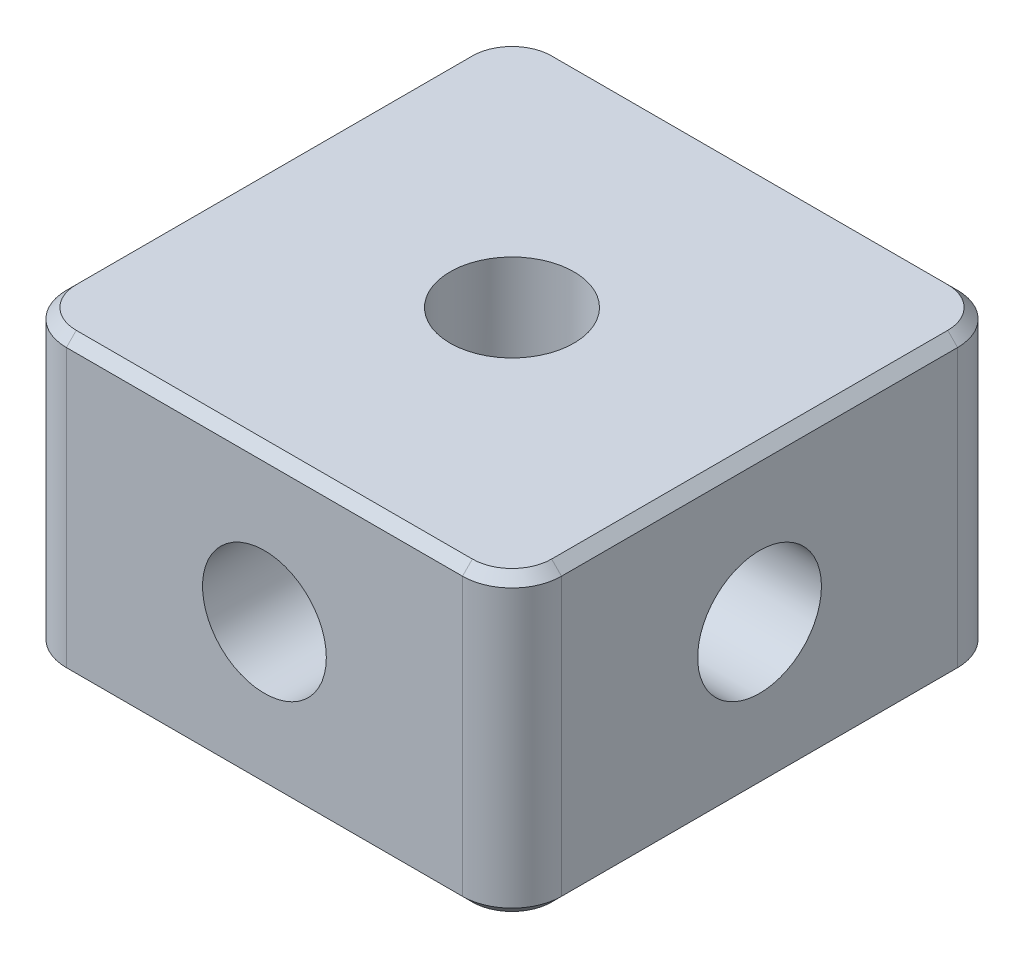
ISO-10303-21;
HEADER;
FILE_DESCRIPTION(('STEP AP214'),'2;1');
FILE_NAME('part.step','',(''),(''),'','','');
FILE_SCHEMA(('AUTOMOTIVE_DESIGN { 1 0 10303 214 1 1 1 1 }'));
ENDSEC;
DATA;
#1=APPLICATION_CONTEXT('core data for automotive mechanical design processes');
#2=APPLICATION_PROTOCOL_DEFINITION('international standard','automotive_design',2000,#1);
#3=PRODUCT_CONTEXT('',#1,'mechanical');
#4=PRODUCT('Part','Part','',(#3));
#5=PRODUCT_RELATED_PRODUCT_CATEGORY('part','',(#4));
#6=PRODUCT_DEFINITION_FORMATION('','',#4);
#7=PRODUCT_DEFINITION_CONTEXT('part definition',#1,'design');
#8=PRODUCT_DEFINITION('design','',#6,#7);
#9=PRODUCT_DEFINITION_SHAPE('','',#8);
#10=(LENGTH_UNIT() NAMED_UNIT(*) SI_UNIT(.MILLI.,.METRE.));
#11=(NAMED_UNIT(*) PLANE_ANGLE_UNIT() SI_UNIT($,.RADIAN.));
#12=(NAMED_UNIT(*) SI_UNIT($,.STERADIAN.) SOLID_ANGLE_UNIT());
#13=UNCERTAINTY_MEASURE_WITH_UNIT(LENGTH_MEASURE(1.E-05),#10,'distance_accuracy_value','');
#14=(GEOMETRIC_REPRESENTATION_CONTEXT(3) GLOBAL_UNCERTAINTY_ASSIGNED_CONTEXT((#13)) GLOBAL_UNIT_ASSIGNED_CONTEXT((#10,
#11,#12)) REPRESENTATION_CONTEXT('',''));
#15=CARTESIAN_POINT('',(0.,0.,0.));
#16=DIRECTION('',(0.,0.,1.));
#17=DIRECTION('',(1.,0.,0.));
#18=AXIS2_PLACEMENT_3D('',#15,#16,#17);
#19=CARTESIAN_POINT('',(0.,3.,0.));
#20=DIRECTION('',(0.,1.,0.));
#21=DIRECTION('',(0.,0.,1.));
#22=AXIS2_PLACEMENT_3D('',#19,#20,#21);
#23=CYLINDRICAL_SURFACE('',#22,1.25);
#24=CARTESIAN_POINT('',(0.,3.,0.));
#25=DIRECTION('',(0.,1.,0.));
#26=DIRECTION('',(0.,0.,1.));
#27=AXIS2_PLACEMENT_3D('',#24,#25,#26);
#28=CIRCLE('',#27,1.25);
#29=CARTESIAN_POINT('',(0.,3.,1.25));
#30=VERTEX_POINT('',#29);
#31=EDGE_CURVE('E483',#30,#30,#28,.T.);
#32=ORIENTED_EDGE('',*,*,#31,.T.);
#33=EDGE_LOOP('',(#32));
#34=FACE_BOUND('',#33,.T.);
#35=CARTESIAN_POINT('',(0.,0.,0.));
#36=DIRECTION('',(0.,0.707106781186547,-0.707106781186547));
#37=DIRECTION('',(0.,0.707106781186547,0.707106781186547));
#38=AXIS2_PLACEMENT_3D('',#35,#36,#37);
#39=ELLIPSE('',#38,1.76776695296636,1.24999999999999);
#40=CARTESIAN_POINT('',(0.883883476483181,0.883883476483181,0.883883476483181));
#41=VERTEX_POINT('',#40);
#42=CARTESIAN_POINT('',(-0.88388347648318,0.88388347648318,0.88388347648318));
#43=VERTEX_POINT('',#42);
#44=EDGE_CURVE('E492',#41,#43,#39,.F.);
#45=ORIENTED_EDGE('',*,*,#44,.T.);
#46=CARTESIAN_POINT('',(0.,0.,0.));
#47=DIRECTION('',(0.707106781186547,0.707106781186547,0.));
#48=DIRECTION('',(-0.707106781186547,0.707106781186547,0.));
#49=AXIS2_PLACEMENT_3D('',#46,#47,#48);
#50=ELLIPSE('',#49,1.76776695296636,1.24999999999999);
#51=CARTESIAN_POINT('',(-0.88388347648318,0.88388347648318,-0.88388347648318));
#52=VERTEX_POINT('',#51);
#53=EDGE_CURVE('E194',#43,#52,#50,.F.);
#54=ORIENTED_EDGE('',*,*,#53,.T.);
#55=CARTESIAN_POINT('',(0.,0.,0.));
#56=DIRECTION('',(0.,0.707106781186547,0.707106781186547));
#57=DIRECTION('',(0.,0.707106781186547,-0.707106781186547));
#58=AXIS2_PLACEMENT_3D('',#55,#56,#57);
#59=ELLIPSE('',#58,1.76776695296636,1.24999999999999);
#60=CARTESIAN_POINT('',(0.883883476483181,0.883883476483181,-0.883883476483181));
#61=VERTEX_POINT('',#60);
#62=EDGE_CURVE('E195',#52,#61,#59,.F.);
#63=ORIENTED_EDGE('',*,*,#62,.T.);
#64=CARTESIAN_POINT('',(0.,0.,0.));
#65=DIRECTION('',(-0.707106781186547,0.707106781186547,0.));
#66=DIRECTION('',(0.707106781186547,0.707106781186547,0.));
#67=AXIS2_PLACEMENT_3D('',#64,#65,#66);
#68=ELLIPSE('',#67,1.76776695296636,1.24999999999999);
#69=EDGE_CURVE('E182',#61,#41,#68,.F.);
#70=ORIENTED_EDGE('',*,*,#69,.T.);
#71=EDGE_LOOP('',(#45,#54,#63,#70));
#72=FACE_BOUND('',#71,.T.);
#73=ADVANCED_FACE('F41',(#34,#72),#23,.F.);
#74=CARTESIAN_POINT('',(5.,3.,5.));
#75=DIRECTION('',(-1.,0.,0.));
#76=DIRECTION('',(0.,0.,1.));
#77=AXIS2_PLACEMENT_3D('',#74,#75,#76);
#78=PLANE('',#77);
#79=CARTESIAN_POINT('',(5.,0.,0.));
#80=DIRECTION('',(1.,0.,0.));
#81=DIRECTION('',(0.,0.,-1.));
#82=AXIS2_PLACEMENT_3D('',#79,#80,#81);
#83=CIRCLE('',#82,1.24999999999999);
#84=CARTESIAN_POINT('',(5.,0.,-1.24999999999999));
#85=VERTEX_POINT('',#84);
#86=EDGE_CURVE('E374',#85,#85,#83,.T.);
#87=ORIENTED_EDGE('',*,*,#86,.F.);
#88=EDGE_LOOP('',(#87));
#89=FACE_BOUND('',#88,.T.);
#90=DIRECTION('',(0.,-1.,0.));
#91=VECTOR('',#90,1.);
#92=CARTESIAN_POINT('',(5.,3.,4.));
#93=LINE('',#92,#91);
#94=CARTESIAN_POINT('',(5.,2.8,4.));
#95=VERTEX_POINT('',#94);
#96=CARTESIAN_POINT('',(5.,-2.8,4.));
#97=VERTEX_POINT('',#96);
#98=EDGE_CURVE('E226',#95,#97,#93,.T.);
#99=ORIENTED_EDGE('',*,*,#98,.T.);
#100=DIRECTION('',(0.,0.,-1.));
#101=VECTOR('',#100,1.);
#102=CARTESIAN_POINT('',(5.,-2.8,-4.));
#103=LINE('',#102,#101);
#104=CARTESIAN_POINT('',(5.,-2.8,-4.));
#105=VERTEX_POINT('',#104);
#106=EDGE_CURVE('E254',#97,#105,#103,.T.);
#107=ORIENTED_EDGE('',*,*,#106,.T.);
#108=DIRECTION('',(0.,-1.,0.));
#109=VECTOR('',#108,1.);
#110=CARTESIAN_POINT('',(5.,3.,-4.));
#111=LINE('',#110,#109);
#112=CARTESIAN_POINT('',(5.,2.8,-4.));
#113=VERTEX_POINT('',#112);
#114=EDGE_CURVE('E230',#105,#113,#111,.F.);
#115=ORIENTED_EDGE('',*,*,#114,.T.);
#116=DIRECTION('',(0.,0.,1.));
#117=VECTOR('',#116,1.);
#118=CARTESIAN_POINT('',(5.,2.8,5.));
#119=LINE('',#118,#117);
#120=EDGE_CURVE('E250',#113,#95,#119,.T.);
#121=ORIENTED_EDGE('',*,*,#120,.T.);
#122=EDGE_LOOP('',(#99,#107,#115,#121));
#123=FACE_BOUND('',#122,.T.);
#124=ADVANCED_FACE('F468',(#89,#123),#78,.F.);
#125=CARTESIAN_POINT('',(-5.,3.,-5.));
#126=DIRECTION('',(0.,0.,1.));
#127=DIRECTION('',(1.,0.,0.));
#128=AXIS2_PLACEMENT_3D('',#125,#126,#127);
#129=PLANE('',#128);
#130=CARTESIAN_POINT('',(0.,0.,-5.));
#131=DIRECTION('',(0.,0.,1.));
#132=DIRECTION('',(1.,0.,0.));
#133=AXIS2_PLACEMENT_3D('',#130,#131,#132);
#134=CIRCLE('',#133,1.25);
#135=CARTESIAN_POINT('',(1.25,0.,-5.));
#136=VERTEX_POINT('',#135);
#137=EDGE_CURVE('E487',#136,#136,#134,.T.);
#138=ORIENTED_EDGE('',*,*,#137,.T.);
#139=EDGE_LOOP('',(#138));
#140=FACE_BOUND('',#139,.T.);
#141=DIRECTION('',(0.,-1.,0.));
#142=VECTOR('',#141,1.);
#143=CARTESIAN_POINT('',(4.,3.,-5.));
#144=LINE('',#143,#142);
#145=CARTESIAN_POINT('',(4.,2.8,-5.));
#146=VERTEX_POINT('',#145);
#147=CARTESIAN_POINT('',(4.,-2.8,-5.));
#148=VERTEX_POINT('',#147);
#149=EDGE_CURVE('E222',#146,#148,#144,.T.);
#150=ORIENTED_EDGE('',*,*,#149,.T.);
#151=DIRECTION('',(-1.,0.,0.));
#152=VECTOR('',#151,1.);
#153=CARTESIAN_POINT('',(-4.,-2.8,-5.));
#154=LINE('',#153,#152);
#155=CARTESIAN_POINT('',(-4.,-2.8,-5.));
#156=VERTEX_POINT('',#155);
#157=EDGE_CURVE('E298',#148,#156,#154,.T.);
#158=ORIENTED_EDGE('',*,*,#157,.T.);
#159=DIRECTION('',(0.,-1.,0.));
#160=VECTOR('',#159,1.);
#161=CARTESIAN_POINT('',(-4.,3.,-5.));
#162=LINE('',#161,#160);
#163=CARTESIAN_POINT('',(-4.,2.8,-5.));
#164=VERTEX_POINT('',#163);
#165=EDGE_CURVE('E218',#156,#164,#162,.F.);
#166=ORIENTED_EDGE('',*,*,#165,.T.);
#167=DIRECTION('',(1.,0.,0.));
#168=VECTOR('',#167,1.);
#169=CARTESIAN_POINT('',(-5.,2.8,-5.));
#170=LINE('',#169,#168);
#171=EDGE_CURVE('E295',#164,#146,#170,.T.);
#172=ORIENTED_EDGE('',*,*,#171,.T.);
#173=EDGE_LOOP('',(#150,#158,#166,#172));
#174=FACE_BOUND('',#173,.T.);
#175=ADVANCED_FACE('F531',(#140,#174),#129,.F.);
#176=CARTESIAN_POINT('',(-5.,3.,5.));
#177=DIRECTION('',(1.,0.,0.));
#178=DIRECTION('',(0.,0.,-1.));
#179=AXIS2_PLACEMENT_3D('',#176,#177,#178);
#180=PLANE('',#179);
#181=CARTESIAN_POINT('',(-5.,0.,0.));
#182=DIRECTION('',(1.,0.,0.));
#183=DIRECTION('',(0.,0.,-1.));
#184=AXIS2_PLACEMENT_3D('',#181,#182,#183);
#185=CIRCLE('',#184,1.25);
#186=CARTESIAN_POINT('',(-5.,0.,-1.25));
#187=VERTEX_POINT('',#186);
#188=EDGE_CURVE('E820',#187,#187,#185,.T.);
#189=ORIENTED_EDGE('',*,*,#188,.T.);
#190=EDGE_LOOP('',(#189));
#191=FACE_BOUND('',#190,.T.);
#192=DIRECTION('',(0.,-1.,0.));
#193=VECTOR('',#192,1.);
#194=CARTESIAN_POINT('',(-5.,3.,-4.));
#195=LINE('',#194,#193);
#196=CARTESIAN_POINT('',(-5.,2.8,-4.));
#197=VERTEX_POINT('',#196);
#198=CARTESIAN_POINT('',(-5.,-2.8,-4.));
#199=VERTEX_POINT('',#198);
#200=EDGE_CURVE('E242',#197,#199,#195,.T.);
#201=ORIENTED_EDGE('',*,*,#200,.T.);
#202=DIRECTION('',(0.,0.,1.));
#203=VECTOR('',#202,1.);
#204=CARTESIAN_POINT('',(-5.,-2.8,4.));
#205=LINE('',#204,#203);
#206=CARTESIAN_POINT('',(-5.,-2.8,4.));
#207=VERTEX_POINT('',#206);
#208=EDGE_CURVE('E322',#199,#207,#205,.T.);
#209=ORIENTED_EDGE('',*,*,#208,.T.);
#210=DIRECTION('',(0.,-1.,0.));
#211=VECTOR('',#210,1.);
#212=CARTESIAN_POINT('',(-5.,3.,4.));
#213=LINE('',#212,#211);
#214=CARTESIAN_POINT('',(-5.,2.8,4.));
#215=VERTEX_POINT('',#214);
#216=EDGE_CURVE('E246',#207,#215,#213,.F.);
#217=ORIENTED_EDGE('',*,*,#216,.T.);
#218=DIRECTION('',(0.,0.,-1.));
#219=VECTOR('',#218,1.);
#220=CARTESIAN_POINT('',(-5.,2.8,5.));
#221=LINE('',#220,#219);
#222=EDGE_CURVE('E319',#215,#197,#221,.T.);
#223=ORIENTED_EDGE('',*,*,#222,.T.);
#224=EDGE_LOOP('',(#201,#209,#217,#223));
#225=FACE_BOUND('',#224,.T.);
#226=ADVANCED_FACE('F415',(#191,#225),#180,.F.);
#227=CARTESIAN_POINT('',(-5.,3.,5.));
#228=DIRECTION('',(0.,0.,-1.));
#229=DIRECTION('',(-1.,0.,0.));
#230=AXIS2_PLACEMENT_3D('',#227,#228,#229);
#231=PLANE('',#230);
#232=CARTESIAN_POINT('',(0.,0.,5.));
#233=DIRECTION('',(0.,0.,1.));
#234=DIRECTION('',(1.,0.,0.));
#235=AXIS2_PLACEMENT_3D('',#232,#233,#234);
#236=CIRCLE('',#235,1.24999999999999);
#237=CARTESIAN_POINT('',(1.24999999999999,0.,5.));
#238=VERTEX_POINT('',#237);
#239=EDGE_CURVE('E495',#238,#238,#236,.T.);
#240=ORIENTED_EDGE('',*,*,#239,.F.);
#241=EDGE_LOOP('',(#240));
#242=FACE_BOUND('',#241,.T.);
#243=DIRECTION('',(0.,-1.,0.));
#244=VECTOR('',#243,1.);
#245=CARTESIAN_POINT('',(-4.,3.,5.));
#246=LINE('',#245,#244);
#247=CARTESIAN_POINT('',(-4.,2.8,5.));
#248=VERTEX_POINT('',#247);
#249=CARTESIAN_POINT('',(-4.,-2.8,5.));
#250=VERTEX_POINT('',#249);
#251=EDGE_CURVE('E234',#248,#250,#246,.T.);
#252=ORIENTED_EDGE('',*,*,#251,.T.);
#253=DIRECTION('',(1.,0.,0.));
#254=VECTOR('',#253,1.);
#255=CARTESIAN_POINT('',(4.,-2.8,5.));
#256=LINE('',#255,#254);
#257=CARTESIAN_POINT('',(4.,-2.8,5.));
#258=VERTEX_POINT('',#257);
#259=EDGE_CURVE('E304',#250,#258,#256,.T.);
#260=ORIENTED_EDGE('',*,*,#259,.T.);
#261=DIRECTION('',(0.,-1.,0.));
#262=VECTOR('',#261,1.);
#263=CARTESIAN_POINT('',(4.,3.,5.));
#264=LINE('',#263,#262);
#265=CARTESIAN_POINT('',(4.,2.8,5.));
#266=VERTEX_POINT('',#265);
#267=EDGE_CURVE('E238',#258,#266,#264,.F.);
#268=ORIENTED_EDGE('',*,*,#267,.T.);
#269=DIRECTION('',(-1.,0.,0.));
#270=VECTOR('',#269,1.);
#271=CARTESIAN_POINT('',(-5.,2.8,5.));
#272=LINE('',#271,#270);
#273=EDGE_CURVE('E301',#266,#248,#272,.T.);
#274=ORIENTED_EDGE('',*,*,#273,.T.);
#275=EDGE_LOOP('',(#252,#260,#268,#274));
#276=FACE_BOUND('',#275,.T.);
#277=ADVANCED_FACE('F448',(#242,#276),#231,.F.);
#278=CARTESIAN_POINT('',(0.,3.,0.));
#279=DIRECTION('',(0.,-1.,0.));
#280=DIRECTION('',(0.,0.,-1.));
#281=AXIS2_PLACEMENT_3D('',#278,#279,#280);
#282=PLANE('',#281);
#283=CARTESIAN_POINT('',(4.,3.,4.));
#284=DIRECTION('',(0.,-1.,0.));
#285=DIRECTION('',(0.,0.,-1.));
#286=AXIS2_PLACEMENT_3D('',#283,#284,#285);
#287=CIRCLE('',#286,0.800000000000001);
#288=CARTESIAN_POINT('',(4.,3.,4.8));
#289=VERTEX_POINT('',#288);
#290=CARTESIAN_POINT('',(4.8,3.,4.));
#291=VERTEX_POINT('',#290);
#292=EDGE_CURVE('E66',#289,#291,#287,.F.);
#293=ORIENTED_EDGE('',*,*,#292,.T.);
#294=DIRECTION('',(0.,0.,-1.));
#295=VECTOR('',#294,1.);
#296=CARTESIAN_POINT('',(4.8,3.,0.));
#297=LINE('',#296,#295);
#298=CARTESIAN_POINT('',(4.8,3.,-4.));
#299=VERTEX_POINT('',#298);
#300=EDGE_CURVE('E11',#291,#299,#297,.T.);
#301=ORIENTED_EDGE('',*,*,#300,.T.);
#302=CARTESIAN_POINT('',(4.,3.,-4.));
#303=DIRECTION('',(0.,-1.,0.));
#304=DIRECTION('',(0.,0.,-1.));
#305=AXIS2_PLACEMENT_3D('',#302,#303,#304);
#306=CIRCLE('',#305,0.800000000000001);
#307=CARTESIAN_POINT('',(4.,3.,-4.8));
#308=VERTEX_POINT('',#307);
#309=EDGE_CURVE('E51',#299,#308,#306,.F.);
#310=ORIENTED_EDGE('',*,*,#309,.T.);
#311=DIRECTION('',(-1.,0.,0.));
#312=VECTOR('',#311,1.);
#313=CARTESIAN_POINT('',(0.,3.,-4.8));
#314=LINE('',#313,#312);
#315=CARTESIAN_POINT('',(-4.,3.,-4.8));
#316=VERTEX_POINT('',#315);
#317=EDGE_CURVE('E337',#308,#316,#314,.T.);
#318=ORIENTED_EDGE('',*,*,#317,.T.);
#319=CARTESIAN_POINT('',(-4.,3.,-4.));
#320=DIRECTION('',(0.,-1.,0.));
#321=DIRECTION('',(0.,0.,-1.));
#322=AXIS2_PLACEMENT_3D('',#319,#320,#321);
#323=CIRCLE('',#322,0.800000000000001);
#324=CARTESIAN_POINT('',(-4.8,3.,-4.));
#325=VERTEX_POINT('',#324);
#326=EDGE_CURVE('E331',#316,#325,#323,.F.);
#327=ORIENTED_EDGE('',*,*,#326,.T.);
#328=DIRECTION('',(0.,0.,1.));
#329=VECTOR('',#328,1.);
#330=CARTESIAN_POINT('',(-4.8,3.,0.));
#331=LINE('',#330,#329);
#332=CARTESIAN_POINT('',(-4.8,3.,4.));
#333=VERTEX_POINT('',#332);
#334=EDGE_CURVE('E325',#325,#333,#331,.T.);
#335=ORIENTED_EDGE('',*,*,#334,.T.);
#336=CARTESIAN_POINT('',(-4.,3.,4.));
#337=DIRECTION('',(0.,-1.,0.));
#338=DIRECTION('',(0.,0.,-1.));
#339=AXIS2_PLACEMENT_3D('',#336,#337,#338);
#340=CIRCLE('',#339,0.800000000000001);
#341=CARTESIAN_POINT('',(-4.,3.,4.8));
#342=VERTEX_POINT('',#341);
#343=EDGE_CURVE('E328',#333,#342,#340,.F.);
#344=ORIENTED_EDGE('',*,*,#343,.T.);
#345=DIRECTION('',(1.,0.,0.));
#346=VECTOR('',#345,1.);
#347=CARTESIAN_POINT('',(0.,3.,4.8));
#348=LINE('',#347,#346);
#349=EDGE_CURVE('E334',#342,#289,#348,.T.);
#350=ORIENTED_EDGE('',*,*,#349,.T.);
#351=EDGE_LOOP('',(#293,#301,#310,#318,#327,#335,#344,#350));
#352=FACE_BOUND('',#351,.T.);
#353=ORIENTED_EDGE('',*,*,#31,.F.);
#354=EDGE_LOOP('',(#353));
#355=FACE_BOUND('',#354,.T.);
#356=ADVANCED_FACE('F477',(#352,#355),#282,.F.);
#357=CARTESIAN_POINT('',(0.,-3.,0.));
#358=DIRECTION('',(0.,-1.,0.));
#359=DIRECTION('',(0.,0.,-1.));
#360=AXIS2_PLACEMENT_3D('',#357,#358,#359);
#361=PLANE('',#360);
#362=CARTESIAN_POINT('',(4.,-3.,-4.));
#363=DIRECTION('',(0.,-1.,0.));
#364=DIRECTION('',(0.,0.,-1.));
#365=AXIS2_PLACEMENT_3D('',#362,#363,#364);
#366=CIRCLE('',#365,0.800000000000003);
#367=CARTESIAN_POINT('',(4.,-3.,-4.8));
#368=VERTEX_POINT('',#367);
#369=CARTESIAN_POINT('',(4.8,-3.,-4.));
#370=VERTEX_POINT('',#369);
#371=EDGE_CURVE('E276',#368,#370,#366,.T.);
#372=ORIENTED_EDGE('',*,*,#371,.T.);
#373=DIRECTION('',(0.,0.,1.));
#374=VECTOR('',#373,1.);
#375=CARTESIAN_POINT('',(4.8,-3.,4.));
#376=LINE('',#375,#374);
#377=CARTESIAN_POINT('',(4.8,-3.,4.));
#378=VERTEX_POINT('',#377);
#379=EDGE_CURVE('E279',#370,#378,#376,.T.);
#380=ORIENTED_EDGE('',*,*,#379,.T.);
#381=CARTESIAN_POINT('',(4.,-3.,4.));
#382=DIRECTION('',(0.,-1.,0.));
#383=DIRECTION('',(0.,0.,-1.));
#384=AXIS2_PLACEMENT_3D('',#381,#382,#383);
#385=CIRCLE('',#384,0.800000000000003);
#386=CARTESIAN_POINT('',(4.,-3.,4.8));
#387=VERTEX_POINT('',#386);
#388=EDGE_CURVE('E273',#378,#387,#385,.T.);
#389=ORIENTED_EDGE('',*,*,#388,.T.);
#390=DIRECTION('',(-1.,0.,0.));
#391=VECTOR('',#390,1.);
#392=CARTESIAN_POINT('',(-4.,-3.,4.8));
#393=LINE('',#392,#391);
#394=CARTESIAN_POINT('',(-4.,-3.,4.8));
#395=VERTEX_POINT('',#394);
#396=EDGE_CURVE('E267',#387,#395,#393,.T.);
#397=ORIENTED_EDGE('',*,*,#396,.T.);
#398=CARTESIAN_POINT('',(-4.,-3.,4.));
#399=DIRECTION('',(0.,-1.,0.));
#400=DIRECTION('',(0.,0.,-1.));
#401=AXIS2_PLACEMENT_3D('',#398,#399,#400);
#402=CIRCLE('',#401,0.800000000000003);
#403=CARTESIAN_POINT('',(-4.8,-3.,4.));
#404=VERTEX_POINT('',#403);
#405=EDGE_CURVE('E261',#395,#404,#402,.T.);
#406=ORIENTED_EDGE('',*,*,#405,.T.);
#407=DIRECTION('',(0.,0.,-1.));
#408=VECTOR('',#407,1.);
#409=CARTESIAN_POINT('',(-4.8,-3.,-4.));
#410=LINE('',#409,#408);
#411=CARTESIAN_POINT('',(-4.8,-3.,-4.));
#412=VERTEX_POINT('',#411);
#413=EDGE_CURVE('E258',#404,#412,#410,.T.);
#414=ORIENTED_EDGE('',*,*,#413,.T.);
#415=CARTESIAN_POINT('',(-4.,-3.,-4.));
#416=DIRECTION('',(0.,-1.,0.));
#417=DIRECTION('',(0.,0.,-1.));
#418=AXIS2_PLACEMENT_3D('',#415,#416,#417);
#419=CIRCLE('',#418,0.800000000000003);
#420=CARTESIAN_POINT('',(-4.,-3.,-4.8));
#421=VERTEX_POINT('',#420);
#422=EDGE_CURVE('E264',#412,#421,#419,.T.);
#423=ORIENTED_EDGE('',*,*,#422,.T.);
#424=DIRECTION('',(1.,0.,0.));
#425=VECTOR('',#424,1.);
#426=CARTESIAN_POINT('',(4.,-3.,-4.8));
#427=LINE('',#426,#425);
#428=EDGE_CURVE('E270',#421,#368,#427,.T.);
#429=ORIENTED_EDGE('',*,*,#428,.T.);
#430=EDGE_LOOP('',(#372,#380,#389,#397,#406,#414,#423,#429));
#431=FACE_BOUND('',#430,.T.);
#432=CARTESIAN_POINT('',(0.,-3.,0.));
#433=DIRECTION('',(0.,1.,0.));
#434=DIRECTION('',(0.,0.,1.));
#435=AXIS2_PLACEMENT_3D('',#432,#433,#434);
#436=CIRCLE('',#435,1.25);
#437=CARTESIAN_POINT('',(0.,-3.,1.25));
#438=VERTEX_POINT('',#437);
#439=EDGE_CURVE('E486',#438,#438,#436,.T.);
#440=ORIENTED_EDGE('',*,*,#439,.T.);
#441=EDGE_LOOP('',(#440));
#442=FACE_BOUND('',#441,.T.);
#443=ADVANCED_FACE('F434',(#431,#442),#361,.T.);
#444=CARTESIAN_POINT('',(0.,0.,0.));
#445=DIRECTION('',(0.,0.707106781186547,0.707106781186547));
#446=DIRECTION('',(0.,0.707106781186547,-0.707106781186547));
#447=AXIS2_PLACEMENT_3D('',#444,#445,#446);
#448=ELLIPSE('',#447,1.76776695296636,1.24999999999999);
#449=CARTESIAN_POINT('',(-0.883883476483181,-0.883883476483181,0.883883476483181));
#450=VERTEX_POINT('',#449);
#451=CARTESIAN_POINT('',(0.88388347648318,-0.88388347648318,0.88388347648318));
#452=VERTEX_POINT('',#451);
#453=EDGE_CURVE('E209',#450,#452,#448,.T.);
#454=ORIENTED_EDGE('',*,*,#453,.T.);
#455=CARTESIAN_POINT('',(0.,0.,0.));
#456=DIRECTION('',(0.707106781186547,0.707106781186547,0.));
#457=DIRECTION('',(-0.707106781186547,0.707106781186547,0.));
#458=AXIS2_PLACEMENT_3D('',#455,#456,#457);
#459=ELLIPSE('',#458,1.76776695296636,1.24999999999999);
#460=CARTESIAN_POINT('',(0.88388347648318,-0.88388347648318,-0.88388347648318));
#461=VERTEX_POINT('',#460);
#462=EDGE_CURVE('E205',#452,#461,#459,.T.);
#463=ORIENTED_EDGE('',*,*,#462,.T.);
#464=CARTESIAN_POINT('',(0.,0.,0.));
#465=DIRECTION('',(0.,0.707106781186547,-0.707106781186547));
#466=DIRECTION('',(0.,0.707106781186547,0.707106781186547));
#467=AXIS2_PLACEMENT_3D('',#464,#465,#466);
#468=ELLIPSE('',#467,1.76776695296636,1.24999999999999);
#469=CARTESIAN_POINT('',(-0.883883476483181,-0.883883476483181,-0.883883476483181));
#470=VERTEX_POINT('',#469);
#471=EDGE_CURVE('E203',#461,#470,#468,.T.);
#472=ORIENTED_EDGE('',*,*,#471,.T.);
#473=CARTESIAN_POINT('',(0.,0.,0.));
#474=DIRECTION('',(-0.707106781186547,0.707106781186547,0.));
#475=DIRECTION('',(0.707106781186547,0.707106781186547,0.));
#476=AXIS2_PLACEMENT_3D('',#473,#474,#475);
#477=ELLIPSE('',#476,1.76776695296636,1.24999999999999);
#478=EDGE_CURVE('E505',#470,#450,#477,.T.);
#479=ORIENTED_EDGE('',*,*,#478,.T.);
#480=EDGE_LOOP('',(#454,#463,#472,#479));
#481=FACE_BOUND('',#480,.T.);
#482=ORIENTED_EDGE('',*,*,#439,.F.);
#483=EDGE_LOOP('',(#482));
#484=FACE_BOUND('',#483,.T.);
#485=ADVANCED_FACE('F503',(#481,#484),#23,.F.);
#486=CARTESIAN_POINT('',(0.,0.,5.));
#487=DIRECTION('',(0.,0.,1.));
#488=DIRECTION('',(1.,0.,0.));
#489=AXIS2_PLACEMENT_3D('',#486,#487,#488);
#490=CYLINDRICAL_SURFACE('',#489,1.24999999999999);
#491=ORIENTED_EDGE('',*,*,#239,.T.);
#492=EDGE_LOOP('',(#491));
#493=FACE_BOUND('',#492,.T.);
#494=ORIENTED_EDGE('',*,*,#453,.F.);
#495=CARTESIAN_POINT('',(0.,0.,0.));
#496=DIRECTION('',(0.707106781186547,0.,0.707106781186547));
#497=DIRECTION('',(-0.707106781186547,0.,0.707106781186547));
#498=AXIS2_PLACEMENT_3D('',#495,#496,#497);
#499=ELLIPSE('',#498,1.76776695296636,1.24999999999999);
#500=EDGE_CURVE('E516',#450,#43,#499,.F.);
#501=ORIENTED_EDGE('',*,*,#500,.T.);
#502=ORIENTED_EDGE('',*,*,#44,.F.);
#503=CARTESIAN_POINT('',(0.,0.,0.));
#504=DIRECTION('',(-0.707106781186547,0.,0.707106781186547));
#505=DIRECTION('',(0.707106781186547,0.,0.707106781186547));
#506=AXIS2_PLACEMENT_3D('',#503,#504,#505);
#507=ELLIPSE('',#506,1.76776695296636,1.24999999999999);
#508=EDGE_CURVE('E188',#41,#452,#507,.F.);
#509=ORIENTED_EDGE('',*,*,#508,.T.);
#510=EDGE_LOOP('',(#494,#501,#502,#509));
#511=FACE_BOUND('',#510,.T.);
#512=ADVANCED_FACE('F523',(#493,#511),#490,.F.);
#513=ORIENTED_EDGE('',*,*,#137,.F.);
#514=EDGE_LOOP('',(#513));
#515=FACE_BOUND('',#514,.T.);
#516=ORIENTED_EDGE('',*,*,#471,.F.);
#517=CARTESIAN_POINT('',(0.,0.,0.));
#518=DIRECTION('',(0.707106781186547,0.,0.707106781186547));
#519=DIRECTION('',(-0.707106781186547,0.,0.707106781186547));
#520=AXIS2_PLACEMENT_3D('',#517,#518,#519);
#521=ELLIPSE('',#520,1.76776695296636,1.24999999999999);
#522=EDGE_CURVE('E185',#461,#61,#521,.T.);
#523=ORIENTED_EDGE('',*,*,#522,.T.);
#524=ORIENTED_EDGE('',*,*,#62,.F.);
#525=CARTESIAN_POINT('',(0.,0.,0.));
#526=DIRECTION('',(-0.707106781186547,0.,0.707106781186547));
#527=DIRECTION('',(0.707106781186547,0.,0.707106781186547));
#528=AXIS2_PLACEMENT_3D('',#525,#526,#527);
#529=ELLIPSE('',#528,1.76776695296636,1.24999999999999);
#530=EDGE_CURVE('E510',#52,#470,#529,.T.);
#531=ORIENTED_EDGE('',*,*,#530,.T.);
#532=EDGE_LOOP('',(#516,#523,#524,#531));
#533=FACE_BOUND('',#532,.T.);
#534=ADVANCED_FACE('F200',(#515,#533),#490,.F.);
#535=CARTESIAN_POINT('',(5.,0.,0.));
#536=DIRECTION('',(1.,0.,0.));
#537=DIRECTION('',(0.,0.,-1.));
#538=AXIS2_PLACEMENT_3D('',#535,#536,#537);
#539=CYLINDRICAL_SURFACE('',#538,1.24999999999999);
#540=ORIENTED_EDGE('',*,*,#86,.T.);
#541=EDGE_LOOP('',(#540));
#542=FACE_BOUND('',#541,.T.);
#543=ORIENTED_EDGE('',*,*,#508,.F.);
#544=ORIENTED_EDGE('',*,*,#69,.F.);
#545=ORIENTED_EDGE('',*,*,#522,.F.);
#546=ORIENTED_EDGE('',*,*,#462,.F.);
#547=EDGE_LOOP('',(#543,#544,#545,#546));
#548=FACE_BOUND('',#547,.T.);
#549=ADVANCED_FACE('F184',(#542,#548),#539,.F.);
#550=ORIENTED_EDGE('',*,*,#188,.F.);
#551=EDGE_LOOP('',(#550));
#552=FACE_BOUND('',#551,.T.);
#553=ORIENTED_EDGE('',*,*,#500,.F.);
#554=ORIENTED_EDGE('',*,*,#478,.F.);
#555=ORIENTED_EDGE('',*,*,#530,.F.);
#556=ORIENTED_EDGE('',*,*,#53,.F.);
#557=EDGE_LOOP('',(#553,#554,#555,#556));
#558=FACE_BOUND('',#557,.T.);
#559=ADVANCED_FACE('F585',(#552,#558),#539,.F.);
#560=CARTESIAN_POINT('',(4.,3.,-4.));
#561=DIRECTION('',(0.,-1.,0.));
#562=DIRECTION('',(0.,0.,-1.));
#563=AXIS2_PLACEMENT_3D('',#560,#561,#562);
#564=CYLINDRICAL_SURFACE('',#563,1.);
#565=ORIENTED_EDGE('',*,*,#114,.F.);
#566=CARTESIAN_POINT('',(4.,-2.8,-4.));
#567=DIRECTION('',(0.,-1.,0.));
#568=DIRECTION('',(0.,0.,-1.));
#569=AXIS2_PLACEMENT_3D('',#566,#567,#568);
#570=CIRCLE('',#569,1.);
#571=EDGE_CURVE('E286',#105,#148,#570,.F.);
#572=ORIENTED_EDGE('',*,*,#571,.T.);
#573=ORIENTED_EDGE('',*,*,#149,.F.);
#574=CARTESIAN_POINT('',(4.,2.8,-4.));
#575=DIRECTION('',(0.,-1.,0.));
#576=DIRECTION('',(0.,0.,-1.));
#577=AXIS2_PLACEMENT_3D('',#574,#575,#576);
#578=CIRCLE('',#577,1.);
#579=EDGE_CURVE('E283',#146,#113,#578,.T.);
#580=ORIENTED_EDGE('',*,*,#579,.T.);
#581=EDGE_LOOP('',(#565,#572,#573,#580));
#582=FACE_BOUND('',#581,.T.);
#583=ADVANCED_FACE('F591',(#582),#564,.T.);
#584=CARTESIAN_POINT('',(4.,3.,4.));
#585=DIRECTION('',(0.,-1.,0.));
#586=DIRECTION('',(0.,0.,-1.));
#587=AXIS2_PLACEMENT_3D('',#584,#585,#586);
#588=CYLINDRICAL_SURFACE('',#587,1.);
#589=ORIENTED_EDGE('',*,*,#267,.F.);
#590=CARTESIAN_POINT('',(4.,-2.8,4.));
#591=DIRECTION('',(0.,-1.,0.));
#592=DIRECTION('',(0.,0.,-1.));
#593=AXIS2_PLACEMENT_3D('',#590,#591,#592);
#594=CIRCLE('',#593,1.);
#595=EDGE_CURVE('E292',#258,#97,#594,.F.);
#596=ORIENTED_EDGE('',*,*,#595,.T.);
#597=ORIENTED_EDGE('',*,*,#98,.F.);
#598=CARTESIAN_POINT('',(4.,2.8,4.));
#599=DIRECTION('',(0.,-1.,0.));
#600=DIRECTION('',(0.,0.,-1.));
#601=AXIS2_PLACEMENT_3D('',#598,#599,#600);
#602=CIRCLE('',#601,1.);
#603=EDGE_CURVE('E289',#95,#266,#602,.T.);
#604=ORIENTED_EDGE('',*,*,#603,.T.);
#605=EDGE_LOOP('',(#589,#596,#597,#604));
#606=FACE_BOUND('',#605,.T.);
#607=ADVANCED_FACE('F466',(#606),#588,.T.);
#608=CARTESIAN_POINT('',(-4.,3.,4.));
#609=DIRECTION('',(0.,-1.,0.));
#610=DIRECTION('',(0.,0.,-1.));
#611=AXIS2_PLACEMENT_3D('',#608,#609,#610);
#612=CYLINDRICAL_SURFACE('',#611,1.);
#613=ORIENTED_EDGE('',*,*,#216,.F.);
#614=CARTESIAN_POINT('',(-4.,-2.8,4.));
#615=DIRECTION('',(0.,-1.,0.));
#616=DIRECTION('',(0.,0.,-1.));
#617=AXIS2_PLACEMENT_3D('',#614,#615,#616);
#618=CIRCLE('',#617,1.);
#619=EDGE_CURVE('E316',#207,#250,#618,.F.);
#620=ORIENTED_EDGE('',*,*,#619,.T.);
#621=ORIENTED_EDGE('',*,*,#251,.F.);
#622=CARTESIAN_POINT('',(-4.,2.8,4.));
#623=DIRECTION('',(0.,-1.,0.));
#624=DIRECTION('',(0.,0.,-1.));
#625=AXIS2_PLACEMENT_3D('',#622,#623,#624);
#626=CIRCLE('',#625,1.);
#627=EDGE_CURVE('E313',#248,#215,#626,.T.);
#628=ORIENTED_EDGE('',*,*,#627,.T.);
#629=EDGE_LOOP('',(#613,#620,#621,#628));
#630=FACE_BOUND('',#629,.T.);
#631=ADVANCED_FACE('F444',(#630),#612,.T.);
#632=CARTESIAN_POINT('',(-4.,3.,-4.));
#633=DIRECTION('',(0.,-1.,0.));
#634=DIRECTION('',(0.,0.,-1.));
#635=AXIS2_PLACEMENT_3D('',#632,#633,#634);
#636=CYLINDRICAL_SURFACE('',#635,1.);
#637=ORIENTED_EDGE('',*,*,#165,.F.);
#638=CARTESIAN_POINT('',(-4.,-2.8,-4.));
#639=DIRECTION('',(0.,-1.,0.));
#640=DIRECTION('',(0.,0.,-1.));
#641=AXIS2_PLACEMENT_3D('',#638,#639,#640);
#642=CIRCLE('',#641,1.);
#643=EDGE_CURVE('E310',#156,#199,#642,.F.);
#644=ORIENTED_EDGE('',*,*,#643,.T.);
#645=ORIENTED_EDGE('',*,*,#200,.F.);
#646=CARTESIAN_POINT('',(-4.,2.8,-4.));
#647=DIRECTION('',(0.,-1.,0.));
#648=DIRECTION('',(0.,0.,-1.));
#649=AXIS2_PLACEMENT_3D('',#646,#647,#648);
#650=CIRCLE('',#649,1.);
#651=EDGE_CURVE('E307',#197,#164,#650,.T.);
#652=ORIENTED_EDGE('',*,*,#651,.T.);
#653=EDGE_LOOP('',(#637,#644,#645,#652));
#654=FACE_BOUND('',#653,.T.);
#655=ADVANCED_FACE('F420',(#654),#636,.T.);
#656=CARTESIAN_POINT('',(-5.,-2.8,5.));
#657=DIRECTION('',(-0.707106781186544,-0.707106781186551,0.));
#658=DIRECTION('',(0.,0.,-1.));
#659=AXIS2_PLACEMENT_3D('',#656,#657,#658);
#660=PLANE('',#659);
#661=DIRECTION('',(-0.707106781186552,0.707106781186543,0.));
#662=VECTOR('',#661,1.);
#663=CARTESIAN_POINT('',(-4.8,-3.,-4.));
#664=LINE('',#663,#662);
#665=EDGE_CURVE('E366',#412,#199,#664,.T.);
#666=ORIENTED_EDGE('',*,*,#665,.F.);
#667=ORIENTED_EDGE('',*,*,#413,.F.);
#668=DIRECTION('',(0.707106781186552,-0.707106781186543,0.));
#669=VECTOR('',#668,1.);
#670=CARTESIAN_POINT('',(-5.,-2.8,4.));
#671=LINE('',#670,#669);
#672=EDGE_CURVE('E370',#207,#404,#671,.T.);
#673=ORIENTED_EDGE('',*,*,#672,.F.);
#674=ORIENTED_EDGE('',*,*,#208,.F.);
#675=EDGE_LOOP('',(#666,#667,#673,#674));
#676=FACE_BOUND('',#675,.T.);
#677=ADVANCED_FACE('F441',(#676),#660,.T.);
#678=CARTESIAN_POINT('',(-4.,-3.,4.));
#679=DIRECTION('',(0.,1.,0.));
#680=DIRECTION('',(0.,0.,1.));
#681=AXIS2_PLACEMENT_3D('',#678,#679,#680);
#682=CONICAL_SURFACE('',#681,0.800000000000003,0.785398163397453);
#683=ORIENTED_EDGE('',*,*,#672,.T.);
#684=ORIENTED_EDGE('',*,*,#405,.F.);
#685=DIRECTION('',(0.,-0.707106781186544,-0.707106781186551));
#686=VECTOR('',#685,1.);
#687=CARTESIAN_POINT('',(-4.,-2.8,5.));
#688=LINE('',#687,#686);
#689=EDGE_CURVE('E362',#250,#395,#688,.T.);
#690=ORIENTED_EDGE('',*,*,#689,.F.);
#691=ORIENTED_EDGE('',*,*,#619,.F.);
#692=EDGE_LOOP('',(#683,#684,#690,#691));
#693=FACE_BOUND('',#692,.T.);
#694=ADVANCED_FACE('F453',(#693),#682,.T.);
#695=CARTESIAN_POINT('',(-4.,-3.,-4.));
#696=DIRECTION('',(0.,1.,0.));
#697=DIRECTION('',(0.,0.,1.));
#698=AXIS2_PLACEMENT_3D('',#695,#696,#697);
#699=CONICAL_SURFACE('',#698,0.800000000000003,0.785398163397453);
#700=ORIENTED_EDGE('',*,*,#665,.T.);
#701=ORIENTED_EDGE('',*,*,#643,.F.);
#702=DIRECTION('',(0.,0.707106781186544,-0.707106781186551));
#703=VECTOR('',#702,1.);
#704=CARTESIAN_POINT('',(-4.,-3.,-4.8));
#705=LINE('',#704,#703);
#706=EDGE_CURVE('E358',#421,#156,#705,.T.);
#707=ORIENTED_EDGE('',*,*,#706,.F.);
#708=ORIENTED_EDGE('',*,*,#422,.F.);
#709=EDGE_LOOP('',(#700,#701,#707,#708));
#710=FACE_BOUND('',#709,.T.);
#711=ADVANCED_FACE('F424',(#710),#699,.T.);
#712=CARTESIAN_POINT('',(-5.,-2.8,5.));
#713=DIRECTION('',(0.,-0.707106781186551,0.707106781186544));
#714=DIRECTION('',(-1.,0.,0.));
#715=AXIS2_PLACEMENT_3D('',#712,#713,#714);
#716=PLANE('',#715);
#717=ORIENTED_EDGE('',*,*,#689,.T.);
#718=ORIENTED_EDGE('',*,*,#396,.F.);
#719=DIRECTION('',(0.,-0.707106781186544,-0.707106781186551));
#720=VECTOR('',#719,1.);
#721=CARTESIAN_POINT('',(4.,-2.8,5.));
#722=LINE('',#721,#720);
#723=EDGE_CURVE('E354',#258,#387,#722,.T.);
#724=ORIENTED_EDGE('',*,*,#723,.F.);
#725=ORIENTED_EDGE('',*,*,#259,.F.);
#726=EDGE_LOOP('',(#717,#718,#724,#725));
#727=FACE_BOUND('',#726,.T.);
#728=ADVANCED_FACE('F457',(#727),#716,.T.);
#729=CARTESIAN_POINT('',(-5.,-2.8,-5.));
#730=DIRECTION('',(0.,-0.707106781186551,-0.707106781186544));
#731=DIRECTION('',(1.,0.,0.));
#732=AXIS2_PLACEMENT_3D('',#729,#730,#731);
#733=PLANE('',#732);
#734=ORIENTED_EDGE('',*,*,#706,.T.);
#735=ORIENTED_EDGE('',*,*,#157,.F.);
#736=DIRECTION('',(0.,0.707106781186544,-0.707106781186551));
#737=VECTOR('',#736,1.);
#738=CARTESIAN_POINT('',(4.,-3.,-4.8));
#739=LINE('',#738,#737);
#740=EDGE_CURVE('E350',#368,#148,#739,.T.);
#741=ORIENTED_EDGE('',*,*,#740,.F.);
#742=ORIENTED_EDGE('',*,*,#428,.F.);
#743=EDGE_LOOP('',(#734,#735,#741,#742));
#744=FACE_BOUND('',#743,.T.);
#745=ADVANCED_FACE('F430',(#744),#733,.T.);
#746=CARTESIAN_POINT('',(4.,-3.,4.));
#747=DIRECTION('',(0.,1.,0.));
#748=DIRECTION('',(0.,0.,1.));
#749=AXIS2_PLACEMENT_3D('',#746,#747,#748);
#750=CONICAL_SURFACE('',#749,0.800000000000003,0.785398163397453);
#751=ORIENTED_EDGE('',*,*,#723,.T.);
#752=ORIENTED_EDGE('',*,*,#388,.F.);
#753=DIRECTION('',(-0.707106781186551,-0.707106781186544,0.));
#754=VECTOR('',#753,1.);
#755=CARTESIAN_POINT('',(5.,-2.8,4.));
#756=LINE('',#755,#754);
#757=EDGE_CURVE('E347',#97,#378,#756,.T.);
#758=ORIENTED_EDGE('',*,*,#757,.F.);
#759=ORIENTED_EDGE('',*,*,#595,.F.);
#760=EDGE_LOOP('',(#751,#752,#758,#759));
#761=FACE_BOUND('',#760,.T.);
#762=ADVANCED_FACE('F462',(#761),#750,.T.);
#763=CARTESIAN_POINT('',(4.,-3.,-4.));
#764=DIRECTION('',(0.,1.,0.));
#765=DIRECTION('',(0.,0.,1.));
#766=AXIS2_PLACEMENT_3D('',#763,#764,#765);
#767=CONICAL_SURFACE('',#766,0.800000000000003,0.785398163397453);
#768=ORIENTED_EDGE('',*,*,#740,.T.);
#769=ORIENTED_EDGE('',*,*,#571,.F.);
#770=DIRECTION('',(0.707106781186551,0.707106781186544,0.));
#771=VECTOR('',#770,1.);
#772=CARTESIAN_POINT('',(4.8,-3.,-4.));
#773=LINE('',#772,#771);
#774=EDGE_CURVE('E344',#370,#105,#773,.T.);
#775=ORIENTED_EDGE('',*,*,#774,.F.);
#776=ORIENTED_EDGE('',*,*,#371,.F.);
#777=EDGE_LOOP('',(#768,#769,#775,#776));
#778=FACE_BOUND('',#777,.T.);
#779=ADVANCED_FACE('F697',(#778),#767,.T.);
#780=CARTESIAN_POINT('',(5.,-2.8,5.));
#781=DIRECTION('',(0.707106781186544,-0.707106781186551,0.));
#782=DIRECTION('',(0.,0.,1.));
#783=AXIS2_PLACEMENT_3D('',#780,#781,#782);
#784=PLANE('',#783);
#785=ORIENTED_EDGE('',*,*,#757,.T.);
#786=ORIENTED_EDGE('',*,*,#379,.F.);
#787=ORIENTED_EDGE('',*,*,#774,.T.);
#788=ORIENTED_EDGE('',*,*,#106,.F.);
#789=EDGE_LOOP('',(#785,#786,#787,#788));
#790=FACE_BOUND('',#789,.T.);
#791=ADVANCED_FACE('F704',(#790),#784,.T.);
#792=CARTESIAN_POINT('',(-4.8,3.,0.));
#793=DIRECTION('',(0.70710678118655,-0.707106781186545,0.));
#794=DIRECTION('',(0.,0.,1.));
#795=AXIS2_PLACEMENT_3D('',#792,#793,#794);
#796=PLANE('',#795);
#797=DIRECTION('',(0.707106781186544,0.707106781186551,0.));
#798=VECTOR('',#797,1.);
#799=CARTESIAN_POINT('',(-5.,2.8,-4.));
#800=LINE('',#799,#798);
#801=EDGE_CURVE('E395',#197,#325,#800,.T.);
#802=ORIENTED_EDGE('',*,*,#801,.F.);
#803=ORIENTED_EDGE('',*,*,#222,.F.);
#804=DIRECTION('',(-0.707106781186544,-0.707106781186551,0.));
#805=VECTOR('',#804,1.);
#806=CARTESIAN_POINT('',(-4.8,3.,4.));
#807=LINE('',#806,#805);
#808=EDGE_CURVE('E45',#333,#215,#807,.T.);
#809=ORIENTED_EDGE('',*,*,#808,.F.);
#810=ORIENTED_EDGE('',*,*,#334,.F.);
#811=EDGE_LOOP('',(#802,#803,#809,#810));
#812=FACE_BOUND('',#811,.T.);
#813=ADVANCED_FACE('F43',(#812),#796,.F.);
#814=CARTESIAN_POINT('',(-4.,3.,4.));
#815=DIRECTION('',(0.,-1.,0.));
#816=DIRECTION('',(0.,0.,-1.));
#817=AXIS2_PLACEMENT_3D('',#814,#815,#816);
#818=CONICAL_SURFACE('',#817,0.800000000000001,0.785398163397444);
#819=ORIENTED_EDGE('',*,*,#808,.T.);
#820=ORIENTED_EDGE('',*,*,#627,.F.);
#821=DIRECTION('',(0.,-0.707106781186551,0.707106781186544));
#822=VECTOR('',#821,1.);
#823=CARTESIAN_POINT('',(-4.,3.,4.8));
#824=LINE('',#823,#822);
#825=EDGE_CURVE('E392',#342,#248,#824,.T.);
#826=ORIENTED_EDGE('',*,*,#825,.F.);
#827=ORIENTED_EDGE('',*,*,#343,.F.);
#828=EDGE_LOOP('',(#819,#820,#826,#827));
#829=FACE_BOUND('',#828,.T.);
#830=ADVANCED_FACE('F408',(#829),#818,.T.);
#831=CARTESIAN_POINT('',(-4.,3.,-4.));
#832=DIRECTION('',(0.,-1.,0.));
#833=DIRECTION('',(0.,0.,-1.));
#834=AXIS2_PLACEMENT_3D('',#831,#832,#833);
#835=CONICAL_SURFACE('',#834,0.800000000000001,0.785398163397444);
#836=ORIENTED_EDGE('',*,*,#801,.T.);
#837=ORIENTED_EDGE('',*,*,#326,.F.);
#838=DIRECTION('',(0.,0.707106781186551,0.707106781186544));
#839=VECTOR('',#838,1.);
#840=CARTESIAN_POINT('',(-4.,2.8,-5.));
#841=LINE('',#840,#839);
#842=EDGE_CURVE('E388',#164,#316,#841,.T.);
#843=ORIENTED_EDGE('',*,*,#842,.F.);
#844=ORIENTED_EDGE('',*,*,#651,.F.);
#845=EDGE_LOOP('',(#836,#837,#843,#844));
#846=FACE_BOUND('',#845,.T.);
#847=ADVANCED_FACE('F724',(#846),#835,.T.);
#848=CARTESIAN_POINT('',(0.,3.,4.8));
#849=DIRECTION('',(0.,-0.707106781186544,-0.707106781186551));
#850=DIRECTION('',(1.,0.,0.));
#851=AXIS2_PLACEMENT_3D('',#848,#849,#850);
#852=PLANE('',#851);
#853=ORIENTED_EDGE('',*,*,#825,.T.);
#854=ORIENTED_EDGE('',*,*,#273,.F.);
#855=DIRECTION('',(0.,-0.707106781186551,0.707106781186544));
#856=VECTOR('',#855,1.);
#857=CARTESIAN_POINT('',(4.,3.,4.8));
#858=LINE('',#857,#856);
#859=EDGE_CURVE('E384',#289,#266,#858,.T.);
#860=ORIENTED_EDGE('',*,*,#859,.F.);
#861=ORIENTED_EDGE('',*,*,#349,.F.);
#862=EDGE_LOOP('',(#853,#854,#860,#861));
#863=FACE_BOUND('',#862,.T.);
#864=ADVANCED_FACE('F730',(#863),#852,.F.);
#865=CARTESIAN_POINT('',(0.,3.,-4.8));
#866=DIRECTION('',(0.,-0.707106781186544,0.707106781186551));
#867=DIRECTION('',(-1.,0.,0.));
#868=AXIS2_PLACEMENT_3D('',#865,#866,#867);
#869=PLANE('',#868);
#870=ORIENTED_EDGE('',*,*,#842,.T.);
#871=ORIENTED_EDGE('',*,*,#317,.F.);
#872=DIRECTION('',(0.,0.707106781186551,0.707106781186544));
#873=VECTOR('',#872,1.);
#874=CARTESIAN_POINT('',(4.,2.8,-5.));
#875=LINE('',#874,#873);
#876=EDGE_CURVE('E380',#146,#308,#875,.T.);
#877=ORIENTED_EDGE('',*,*,#876,.F.);
#878=ORIENTED_EDGE('',*,*,#171,.F.);
#879=EDGE_LOOP('',(#870,#871,#877,#878));
#880=FACE_BOUND('',#879,.T.);
#881=ADVANCED_FACE('F737',(#880),#869,.F.);
#882=CARTESIAN_POINT('',(4.,3.,4.));
#883=DIRECTION('',(0.,-1.,0.));
#884=DIRECTION('',(0.,0.,-1.));
#885=AXIS2_PLACEMENT_3D('',#882,#883,#884);
#886=CONICAL_SURFACE('',#885,0.800000000000001,0.785398163397444);
#887=ORIENTED_EDGE('',*,*,#859,.T.);
#888=ORIENTED_EDGE('',*,*,#603,.F.);
#889=DIRECTION('',(0.707106781186544,-0.707106781186551,0.));
#890=VECTOR('',#889,1.);
#891=CARTESIAN_POINT('',(4.8,3.,4.));
#892=LINE('',#891,#890);
#893=EDGE_CURVE('E377',#291,#95,#892,.T.);
#894=ORIENTED_EDGE('',*,*,#893,.F.);
#895=ORIENTED_EDGE('',*,*,#292,.F.);
#896=EDGE_LOOP('',(#887,#888,#894,#895));
#897=FACE_BOUND('',#896,.T.);
#898=ADVANCED_FACE('F745',(#897),#886,.T.);
#899=CARTESIAN_POINT('',(4.,3.,-4.));
#900=DIRECTION('',(0.,-1.,0.));
#901=DIRECTION('',(0.,0.,-1.));
#902=AXIS2_PLACEMENT_3D('',#899,#900,#901);
#903=CONICAL_SURFACE('',#902,0.800000000000001,0.785398163397444);
#904=ORIENTED_EDGE('',*,*,#876,.T.);
#905=ORIENTED_EDGE('',*,*,#309,.F.);
#906=DIRECTION('',(-0.707106781186544,0.707106781186551,0.));
#907=VECTOR('',#906,1.);
#908=CARTESIAN_POINT('',(5.,2.8,-4.));
#909=LINE('',#908,#907);
#910=EDGE_CURVE('E59',#113,#299,#909,.T.);
#911=ORIENTED_EDGE('',*,*,#910,.F.);
#912=ORIENTED_EDGE('',*,*,#579,.F.);
#913=EDGE_LOOP('',(#904,#905,#911,#912));
#914=FACE_BOUND('',#913,.T.);
#915=ADVANCED_FACE('F474',(#914),#903,.T.);
#916=CARTESIAN_POINT('',(4.8,3.,0.));
#917=DIRECTION('',(-0.707106781186551,-0.707106781186544,0.));
#918=DIRECTION('',(0.,0.,-1.));
#919=AXIS2_PLACEMENT_3D('',#916,#917,#918);
#920=PLANE('',#919);
#921=ORIENTED_EDGE('',*,*,#893,.T.);
#922=ORIENTED_EDGE('',*,*,#120,.F.);
#923=ORIENTED_EDGE('',*,*,#910,.T.);
#924=ORIENTED_EDGE('',*,*,#300,.F.);
#925=EDGE_LOOP('',(#921,#922,#923,#924));
#926=FACE_BOUND('',#925,.T.);
#927=ADVANCED_FACE('F470',(#926),#920,.F.);
#928=CLOSED_SHELL('',(#73,#124,#175,#226,#277,#356,#443,#485,#512,#534,#549,#559,#583,#607,#631,
#655,#677,#694,#711,#728,#745,#762,#779,#791,#813,#830,#847,#864,#881,#898,#915,#927));
#929=MANIFOLD_SOLID_BREP('B2',#928);
#930=ADVANCED_BREP_SHAPE_REPRESENTATION('',(#18,#929),#14);
#931=SHAPE_DEFINITION_REPRESENTATION(#9,#930);
ENDSEC;
END-ISO-10303-21;
